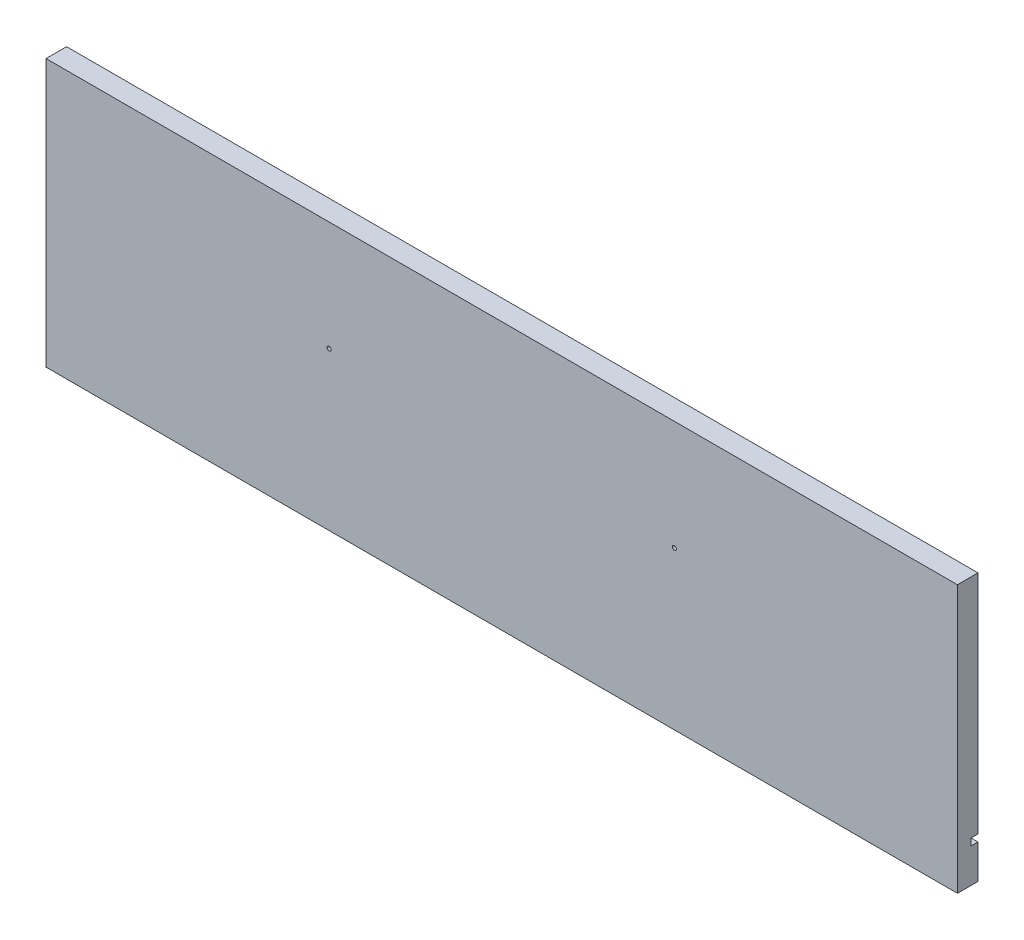
ISO-10303-21;
HEADER;
FILE_DESCRIPTION(('STEP AP214'),'2;1');
FILE_NAME('part.step','',(''),(''),'','','');
FILE_SCHEMA(('AUTOMOTIVE_DESIGN { 1 0 10303 214 1 1 1 1 }'));
ENDSEC;
DATA;
#1=APPLICATION_CONTEXT('core data for automotive mechanical design processes');
#2=APPLICATION_PROTOCOL_DEFINITION('international standard','automotive_design',2000,#1);
#3=PRODUCT_CONTEXT('',#1,'mechanical');
#4=PRODUCT('Part','Part','',(#3));
#5=PRODUCT_RELATED_PRODUCT_CATEGORY('part','',(#4));
#6=PRODUCT_DEFINITION_FORMATION('','',#4);
#7=PRODUCT_DEFINITION_CONTEXT('part definition',#1,'design');
#8=PRODUCT_DEFINITION('design','',#6,#7);
#9=PRODUCT_DEFINITION_SHAPE('','',#8);
#10=(LENGTH_UNIT() NAMED_UNIT(*) SI_UNIT(.MILLI.,.METRE.));
#11=(NAMED_UNIT(*) PLANE_ANGLE_UNIT() SI_UNIT($,.RADIAN.));
#12=(NAMED_UNIT(*) SI_UNIT($,.STERADIAN.) SOLID_ANGLE_UNIT());
#13=UNCERTAINTY_MEASURE_WITH_UNIT(LENGTH_MEASURE(1.E-05),#10,'distance_accuracy_value','');
#14=(GEOMETRIC_REPRESENTATION_CONTEXT(3) GLOBAL_UNCERTAINTY_ASSIGNED_CONTEXT((#13)) GLOBAL_UNIT_ASSIGNED_CONTEXT((#10,
#11,#12)) REPRESENTATION_CONTEXT('',''));
#15=CARTESIAN_POINT('',(0.,0.,0.));
#16=DIRECTION('',(0.,0.,1.));
#17=DIRECTION('',(1.,0.,0.));
#18=AXIS2_PLACEMENT_3D('',#15,#16,#17);
#19=CARTESIAN_POINT('',(-332.5,195.,-15.));
#20=DIRECTION('',(0.,0.,-1.));
#21=DIRECTION('',(-1.,0.,0.));
#22=AXIS2_PLACEMENT_3D('',#19,#20,#21);
#23=PLANE('',#22);
#24=DIRECTION('',(1.,0.,0.));
#25=VECTOR('',#24,1.);
#26=CARTESIAN_POINT('',(-332.5,25.0000000000002,-15.));
#27=LINE('',#26,#25);
#28=CARTESIAN_POINT('',(-332.5,25.0000000000002,-15.));
#29=VERTEX_POINT('',#28);
#30=CARTESIAN_POINT('',(332.5,25.0000000000002,-15.));
#31=VERTEX_POINT('',#30);
#32=EDGE_CURVE('E174',#29,#31,#27,.T.);
#33=ORIENTED_EDGE('',*,*,#32,.T.);
#34=DIRECTION('',(0.,1.,0.));
#35=VECTOR('',#34,1.);
#36=CARTESIAN_POINT('',(332.5,1.22154483793782E-13,-15.));
#37=LINE('',#36,#35);
#38=CARTESIAN_POINT('',(332.5,1.22154483793782E-13,-15.));
#39=VERTEX_POINT('',#38);
#40=EDGE_CURVE('E189',#39,#31,#37,.T.);
#41=ORIENTED_EDGE('',*,*,#40,.F.);
#42=DIRECTION('',(1.,0.,0.));
#43=VECTOR('',#42,1.);
#44=CARTESIAN_POINT('',(-332.5,0.,-15.));
#45=LINE('',#44,#43);
#46=CARTESIAN_POINT('',(-332.5,0.,-15.));
#47=VERTEX_POINT('',#46);
#48=EDGE_CURVE('E185',#47,#39,#45,.T.);
#49=ORIENTED_EDGE('',*,*,#48,.F.);
#50=DIRECTION('',(0.,-1.,0.));
#51=VECTOR('',#50,1.);
#52=CARTESIAN_POINT('',(-332.5,0.,-15.));
#53=LINE('',#52,#51);
#54=EDGE_CURVE('E81',#29,#47,#53,.T.);
#55=ORIENTED_EDGE('',*,*,#54,.F.);
#56=EDGE_LOOP('',(#33,#41,#49,#55));
#57=FACE_BOUND('',#56,.T.);
#58=ADVANCED_FACE('F32',(#57),#23,.T.);
#59=CARTESIAN_POINT('',(-332.5,0.,-15.));
#60=DIRECTION('',(-1.,0.,0.));
#61=DIRECTION('',(0.,0.,1.));
#62=AXIS2_PLACEMENT_3D('',#59,#60,#61);
#63=PLANE('',#62);
#64=DIRECTION('',(0.,0.,-1.));
#65=VECTOR('',#64,1.);
#66=CARTESIAN_POINT('',(-332.5,25.0000000000002,-15.));
#67=LINE('',#66,#65);
#68=CARTESIAN_POINT('',(-332.5,25.0000000000002,-10.));
#69=VERTEX_POINT('',#68);
#70=EDGE_CURVE('E165',#69,#29,#67,.T.);
#71=ORIENTED_EDGE('',*,*,#70,.T.);
#72=ORIENTED_EDGE('',*,*,#54,.T.);
#73=DIRECTION('',(0.,0.,1.));
#74=VECTOR('',#73,1.);
#75=CARTESIAN_POINT('',(-332.5,0.,-15.));
#76=LINE('',#75,#74);
#77=CARTESIAN_POINT('',(-332.5,0.,0.));
#78=VERTEX_POINT('',#77);
#79=EDGE_CURVE('E36',#47,#78,#76,.T.);
#80=ORIENTED_EDGE('',*,*,#79,.T.);
#81=DIRECTION('',(0.,-1.,0.));
#82=VECTOR('',#81,1.);
#83=CARTESIAN_POINT('',(-332.5,0.,0.));
#84=LINE('',#83,#82);
#85=CARTESIAN_POINT('',(-332.5,195.,0.));
#86=VERTEX_POINT('',#85);
#87=EDGE_CURVE('E177',#86,#78,#84,.T.);
#88=ORIENTED_EDGE('',*,*,#87,.F.);
#89=DIRECTION('',(0.,0.,1.));
#90=VECTOR('',#89,1.);
#91=CARTESIAN_POINT('',(-332.5,195.,-15.));
#92=LINE('',#91,#90);
#93=CARTESIAN_POINT('',(-332.5,195.,-15.));
#94=VERTEX_POINT('',#93);
#95=EDGE_CURVE('E11',#94,#86,#92,.T.);
#96=ORIENTED_EDGE('',*,*,#95,.F.);
#97=CARTESIAN_POINT('',(-332.5,30.0000000000002,-15.));
#98=VERTEX_POINT('',#97);
#99=EDGE_CURVE('E183',#94,#98,#53,.T.);
#100=ORIENTED_EDGE('',*,*,#99,.T.);
#101=DIRECTION('',(0.,0.,1.));
#102=VECTOR('',#101,1.);
#103=CARTESIAN_POINT('',(-332.5,30.0000000000002,-15.));
#104=LINE('',#103,#102);
#105=CARTESIAN_POINT('',(-332.5,30.0000000000002,-10.));
#106=VERTEX_POINT('',#105);
#107=EDGE_CURVE('E49',#98,#106,#104,.T.);
#108=ORIENTED_EDGE('',*,*,#107,.T.);
#109=DIRECTION('',(0.,-1.,0.));
#110=VECTOR('',#109,1.);
#111=CARTESIAN_POINT('',(-332.5,25.0000000000002,-10.));
#112=LINE('',#111,#110);
#113=EDGE_CURVE('E161',#106,#69,#112,.T.);
#114=ORIENTED_EDGE('',*,*,#113,.T.);
#115=EDGE_LOOP('',(#71,#72,#80,#88,#96,#100,#108,#114));
#116=FACE_BOUND('',#115,.T.);
#117=ADVANCED_FACE('F34',(#116),#63,.T.);
#118=CARTESIAN_POINT('',(-332.5,195.,-15.));
#119=DIRECTION('',(0.,1.,0.));
#120=DIRECTION('',(-1.,0.,0.));
#121=AXIS2_PLACEMENT_3D('',#118,#119,#120);
#122=PLANE('',#121);
#123=DIRECTION('',(-1.,0.,0.));
#124=VECTOR('',#123,1.);
#125=CARTESIAN_POINT('',(-332.5,195.,0.));
#126=LINE('',#125,#124);
#127=CARTESIAN_POINT('',(332.5,195.,0.));
#128=VERTEX_POINT('',#127);
#129=EDGE_CURVE('E202',#128,#86,#126,.T.);
#130=ORIENTED_EDGE('',*,*,#129,.F.);
#131=DIRECTION('',(0.,0.,1.));
#132=VECTOR('',#131,1.);
#133=CARTESIAN_POINT('',(332.5,195.,-15.));
#134=LINE('',#133,#132);
#135=CARTESIAN_POINT('',(332.5,195.,-15.));
#136=VERTEX_POINT('',#135);
#137=EDGE_CURVE('E41',#136,#128,#134,.T.);
#138=ORIENTED_EDGE('',*,*,#137,.F.);
#139=DIRECTION('',(-1.,0.,0.));
#140=VECTOR('',#139,1.);
#141=CARTESIAN_POINT('',(-332.5,195.,-15.));
#142=LINE('',#141,#140);
#143=EDGE_CURVE('E192',#136,#94,#142,.T.);
#144=ORIENTED_EDGE('',*,*,#143,.T.);
#145=ORIENTED_EDGE('',*,*,#95,.T.);
#146=EDGE_LOOP('',(#130,#138,#144,#145));
#147=FACE_BOUND('',#146,.T.);
#148=ADVANCED_FACE('F214',(#147),#122,.T.);
#149=CARTESIAN_POINT('',(332.5,1.22154483793782E-13,-15.));
#150=DIRECTION('',(1.,0.,0.));
#151=DIRECTION('',(0.,1.,0.));
#152=AXIS2_PLACEMENT_3D('',#149,#150,#151);
#153=PLANE('',#152);
#154=DIRECTION('',(0.,0.,-1.));
#155=VECTOR('',#154,1.);
#156=CARTESIAN_POINT('',(332.5,25.0000000000002,-15.));
#157=LINE('',#156,#155);
#158=CARTESIAN_POINT('',(332.5,25.0000000000002,-10.));
#159=VERTEX_POINT('',#158);
#160=EDGE_CURVE('E162',#159,#31,#157,.T.);
#161=ORIENTED_EDGE('',*,*,#160,.F.);
#162=DIRECTION('',(0.,-1.,0.));
#163=VECTOR('',#162,1.);
#164=CARTESIAN_POINT('',(332.5,25.0000000000002,-10.));
#165=LINE('',#164,#163);
#166=CARTESIAN_POINT('',(332.5,30.0000000000002,-10.));
#167=VERTEX_POINT('',#166);
#168=EDGE_CURVE('E170',#167,#159,#165,.T.);
#169=ORIENTED_EDGE('',*,*,#168,.F.);
#170=DIRECTION('',(0.,0.,1.));
#171=VECTOR('',#170,1.);
#172=CARTESIAN_POINT('',(332.5,30.0000000000002,-15.));
#173=LINE('',#172,#171);
#174=CARTESIAN_POINT('',(332.5,30.0000000000002,-15.));
#175=VERTEX_POINT('',#174);
#176=EDGE_CURVE('E159',#175,#167,#173,.T.);
#177=ORIENTED_EDGE('',*,*,#176,.F.);
#178=EDGE_CURVE('E188',#175,#136,#37,.T.);
#179=ORIENTED_EDGE('',*,*,#178,.T.);
#180=ORIENTED_EDGE('',*,*,#137,.T.);
#181=DIRECTION('',(0.,1.,0.));
#182=VECTOR('',#181,1.);
#183=CARTESIAN_POINT('',(332.5,1.22154483793782E-13,0.));
#184=LINE('',#183,#182);
#185=CARTESIAN_POINT('',(332.5,1.22154483793782E-13,0.));
#186=VERTEX_POINT('',#185);
#187=EDGE_CURVE('E199',#186,#128,#184,.T.);
#188=ORIENTED_EDGE('',*,*,#187,.F.);
#189=DIRECTION('',(0.,0.,1.));
#190=VECTOR('',#189,1.);
#191=CARTESIAN_POINT('',(332.5,1.22154483793782E-13,-15.));
#192=LINE('',#191,#190);
#193=EDGE_CURVE('E205',#39,#186,#192,.T.);
#194=ORIENTED_EDGE('',*,*,#193,.F.);
#195=ORIENTED_EDGE('',*,*,#40,.T.);
#196=EDGE_LOOP('',(#161,#169,#177,#179,#180,#188,#194,#195));
#197=FACE_BOUND('',#196,.T.);
#198=ADVANCED_FACE('F230',(#197),#153,.T.);
#199=CARTESIAN_POINT('',(-332.5,0.,-15.));
#200=DIRECTION('',(0.,-1.,0.));
#201=DIRECTION('',(1.,0.,0.));
#202=AXIS2_PLACEMENT_3D('',#199,#200,#201);
#203=PLANE('',#202);
#204=DIRECTION('',(1.,0.,0.));
#205=VECTOR('',#204,1.);
#206=CARTESIAN_POINT('',(-332.5,0.,0.));
#207=LINE('',#206,#205);
#208=EDGE_CURVE('E196',#78,#186,#207,.T.);
#209=ORIENTED_EDGE('',*,*,#208,.F.);
#210=ORIENTED_EDGE('',*,*,#79,.F.);
#211=ORIENTED_EDGE('',*,*,#48,.T.);
#212=ORIENTED_EDGE('',*,*,#193,.T.);
#213=EDGE_LOOP('',(#209,#210,#211,#212));
#214=FACE_BOUND('',#213,.T.);
#215=ADVANCED_FACE('F210',(#214),#203,.T.);
#216=CARTESIAN_POINT('',(325.,135.,-15.));
#217=DIRECTION('',(0.,0.,-1.));
#218=DIRECTION('',(-1.,0.,0.));
#219=AXIS2_PLACEMENT_3D('',#216,#217,#218);
#220=CIRCLE('',#219,1.5);
#221=CARTESIAN_POINT('',(323.5,135.,-15.));
#222=VERTEX_POINT('',#221);
#223=EDGE_CURVE('E124',#222,#222,#220,.T.);
#224=ORIENTED_EDGE('',*,*,#223,.F.);
#225=EDGE_LOOP('',(#224));
#226=FACE_BOUND('',#225,.T.);
#227=CARTESIAN_POINT('',(325.,45.0000000000002,-15.));
#228=DIRECTION('',(0.,0.,-1.));
#229=DIRECTION('',(-1.,0.,0.));
#230=AXIS2_PLACEMENT_3D('',#227,#228,#229);
#231=CIRCLE('',#230,1.5);
#232=CARTESIAN_POINT('',(323.5,45.0000000000002,-15.));
#233=VERTEX_POINT('',#232);
#234=EDGE_CURVE('E132',#233,#233,#231,.T.);
#235=ORIENTED_EDGE('',*,*,#234,.F.);
#236=EDGE_LOOP('',(#235));
#237=FACE_BOUND('',#236,.T.);
#238=CARTESIAN_POINT('',(-325.,135.000000000001,-15.));
#239=DIRECTION('',(0.,0.,-1.));
#240=DIRECTION('',(-1.,0.,0.));
#241=AXIS2_PLACEMENT_3D('',#238,#239,#240);
#242=CIRCLE('',#241,1.5);
#243=CARTESIAN_POINT('',(-326.5,135.000000000001,-15.));
#244=VERTEX_POINT('',#243);
#245=EDGE_CURVE('E138',#244,#244,#242,.T.);
#246=ORIENTED_EDGE('',*,*,#245,.F.);
#247=EDGE_LOOP('',(#246));
#248=FACE_BOUND('',#247,.T.);
#249=CARTESIAN_POINT('',(-325.,45.0000000000013,-15.));
#250=DIRECTION('',(0.,0.,-1.));
#251=DIRECTION('',(-1.,0.,0.));
#252=AXIS2_PLACEMENT_3D('',#249,#250,#251);
#253=CIRCLE('',#252,1.5);
#254=CARTESIAN_POINT('',(-326.5,45.0000000000013,-15.));
#255=VERTEX_POINT('',#254);
#256=EDGE_CURVE('E144',#255,#255,#253,.T.);
#257=ORIENTED_EDGE('',*,*,#256,.F.);
#258=EDGE_LOOP('',(#257));
#259=FACE_BOUND('',#258,.T.);
#260=CARTESIAN_POINT('',(-126.,115.,-15.));
#261=DIRECTION('',(0.,0.,1.));
#262=DIRECTION('',(1.,0.,0.));
#263=AXIS2_PLACEMENT_3D('',#260,#261,#262);
#264=CIRCLE('',#263,1.5);
#265=CARTESIAN_POINT('',(-124.5,115.,-15.));
#266=VERTEX_POINT('',#265);
#267=EDGE_CURVE('E147',#266,#266,#264,.T.);
#268=ORIENTED_EDGE('',*,*,#267,.T.);
#269=EDGE_LOOP('',(#268));
#270=FACE_BOUND('',#269,.T.);
#271=CARTESIAN_POINT('',(126.,115.,-15.));
#272=DIRECTION('',(0.,0.,1.));
#273=DIRECTION('',(1.,0.,0.));
#274=AXIS2_PLACEMENT_3D('',#271,#272,#273);
#275=CIRCLE('',#274,1.5);
#276=CARTESIAN_POINT('',(127.5,115.,-15.));
#277=VERTEX_POINT('',#276);
#278=EDGE_CURVE('E153',#277,#277,#275,.T.);
#279=ORIENTED_EDGE('',*,*,#278,.T.);
#280=EDGE_LOOP('',(#279));
#281=FACE_BOUND('',#280,.T.);
#282=DIRECTION('',(1.,0.,0.));
#283=VECTOR('',#282,1.);
#284=CARTESIAN_POINT('',(-332.5,30.0000000000002,-15.));
#285=LINE('',#284,#283);
#286=EDGE_CURVE('E167',#98,#175,#285,.T.);
#287=ORIENTED_EDGE('',*,*,#286,.F.);
#288=ORIENTED_EDGE('',*,*,#99,.F.);
#289=ORIENTED_EDGE('',*,*,#143,.F.);
#290=ORIENTED_EDGE('',*,*,#178,.F.);
#291=EDGE_LOOP('',(#287,#288,#289,#290));
#292=FACE_BOUND('',#291,.T.);
#293=ADVANCED_FACE('F219',(#226,#237,#248,#259,#270,#281,#292),#23,.T.);
#294=CARTESIAN_POINT('',(-332.5,195.,0.));
#295=DIRECTION('',(0.,0.,-1.));
#296=DIRECTION('',(-1.,0.,0.));
#297=AXIS2_PLACEMENT_3D('',#294,#295,#296);
#298=PLANE('',#297);
#299=CARTESIAN_POINT('',(-126.,115.,0.));
#300=DIRECTION('',(0.,0.,1.));
#301=DIRECTION('',(1.,0.,0.));
#302=AXIS2_PLACEMENT_3D('',#299,#300,#301);
#303=CIRCLE('',#302,1.5);
#304=CARTESIAN_POINT('',(-124.5,115.,0.));
#305=VERTEX_POINT('',#304);
#306=EDGE_CURVE('E150',#305,#305,#303,.T.);
#307=ORIENTED_EDGE('',*,*,#306,.F.);
#308=EDGE_LOOP('',(#307));
#309=FACE_BOUND('',#308,.T.);
#310=CARTESIAN_POINT('',(126.,115.,0.));
#311=DIRECTION('',(0.,0.,1.));
#312=DIRECTION('',(1.,0.,0.));
#313=AXIS2_PLACEMENT_3D('',#310,#311,#312);
#314=CIRCLE('',#313,1.5);
#315=CARTESIAN_POINT('',(127.5,115.,0.));
#316=VERTEX_POINT('',#315);
#317=EDGE_CURVE('E156',#316,#316,#314,.T.);
#318=ORIENTED_EDGE('',*,*,#317,.F.);
#319=EDGE_LOOP('',(#318));
#320=FACE_BOUND('',#319,.T.);
#321=ORIENTED_EDGE('',*,*,#87,.T.);
#322=ORIENTED_EDGE('',*,*,#208,.T.);
#323=ORIENTED_EDGE('',*,*,#187,.T.);
#324=ORIENTED_EDGE('',*,*,#129,.T.);
#325=EDGE_LOOP('',(#321,#322,#323,#324));
#326=FACE_BOUND('',#325,.T.);
#327=ADVANCED_FACE('F212',(#309,#320,#326),#298,.F.);
#328=CARTESIAN_POINT('',(-332.5,25.0000000000002,-15.));
#329=DIRECTION('',(0.,-1.,0.));
#330=DIRECTION('',(0.,0.,-1.));
#331=AXIS2_PLACEMENT_3D('',#328,#329,#330);
#332=PLANE('',#331);
#333=ORIENTED_EDGE('',*,*,#160,.T.);
#334=ORIENTED_EDGE('',*,*,#32,.F.);
#335=ORIENTED_EDGE('',*,*,#70,.F.);
#336=DIRECTION('',(1.,0.,0.));
#337=VECTOR('',#336,1.);
#338=CARTESIAN_POINT('',(-332.5,25.0000000000002,-10.));
#339=LINE('',#338,#337);
#340=EDGE_CURVE('E178',#69,#159,#339,.T.);
#341=ORIENTED_EDGE('',*,*,#340,.T.);
#342=EDGE_LOOP('',(#333,#334,#335,#341));
#343=FACE_BOUND('',#342,.T.);
#344=ADVANCED_FACE('F227',(#343),#332,.F.);
#345=CARTESIAN_POINT('',(-332.5,25.0000000000002,-10.));
#346=DIRECTION('',(0.,0.,1.));
#347=DIRECTION('',(1.,0.,0.));
#348=AXIS2_PLACEMENT_3D('',#345,#346,#347);
#349=PLANE('',#348);
#350=ORIENTED_EDGE('',*,*,#168,.T.);
#351=ORIENTED_EDGE('',*,*,#340,.F.);
#352=ORIENTED_EDGE('',*,*,#113,.F.);
#353=DIRECTION('',(1.,0.,0.));
#354=VECTOR('',#353,1.);
#355=CARTESIAN_POINT('',(-332.5,30.0000000000002,-10.));
#356=LINE('',#355,#354);
#357=EDGE_CURVE('E180',#106,#167,#356,.T.);
#358=ORIENTED_EDGE('',*,*,#357,.T.);
#359=EDGE_LOOP('',(#350,#351,#352,#358));
#360=FACE_BOUND('',#359,.T.);
#361=ADVANCED_FACE('F223',(#360),#349,.F.);
#362=CARTESIAN_POINT('',(-332.5,30.0000000000002,-15.));
#363=DIRECTION('',(0.,1.,0.));
#364=DIRECTION('',(0.,0.,1.));
#365=AXIS2_PLACEMENT_3D('',#362,#363,#364);
#366=PLANE('',#365);
#367=ORIENTED_EDGE('',*,*,#176,.T.);
#368=ORIENTED_EDGE('',*,*,#357,.F.);
#369=ORIENTED_EDGE('',*,*,#107,.F.);
#370=ORIENTED_EDGE('',*,*,#286,.T.);
#371=EDGE_LOOP('',(#367,#368,#369,#370));
#372=FACE_BOUND('',#371,.T.);
#373=ADVANCED_FACE('F232',(#372),#366,.F.);
#374=CARTESIAN_POINT('',(126.,115.,0.));
#375=DIRECTION('',(0.,0.,1.));
#376=DIRECTION('',(1.,0.,0.));
#377=AXIS2_PLACEMENT_3D('',#374,#375,#376);
#378=CYLINDRICAL_SURFACE('',#377,1.5);
#379=ORIENTED_EDGE('',*,*,#278,.F.);
#380=EDGE_LOOP('',(#379));
#381=FACE_BOUND('',#380,.T.);
#382=ORIENTED_EDGE('',*,*,#317,.T.);
#383=EDGE_LOOP('',(#382));
#384=FACE_BOUND('',#383,.T.);
#385=ADVANCED_FACE('F234',(#381,#384),#378,.F.);
#386=CARTESIAN_POINT('',(-126.,115.,0.));
#387=DIRECTION('',(0.,0.,1.));
#388=DIRECTION('',(1.,0.,0.));
#389=AXIS2_PLACEMENT_3D('',#386,#387,#388);
#390=CYLINDRICAL_SURFACE('',#389,1.5);
#391=ORIENTED_EDGE('',*,*,#267,.F.);
#392=EDGE_LOOP('',(#391));
#393=FACE_BOUND('',#392,.T.);
#394=ORIENTED_EDGE('',*,*,#306,.T.);
#395=EDGE_LOOP('',(#394));
#396=FACE_BOUND('',#395,.T.);
#397=ADVANCED_FACE('F240',(#393,#396),#390,.F.);
#398=CARTESIAN_POINT('',(-325.,45.0000000000013,-15.));
#399=DIRECTION('',(0.,0.,-1.));
#400=DIRECTION('',(-1.,0.,0.));
#401=AXIS2_PLACEMENT_3D('',#398,#399,#400);
#402=CYLINDRICAL_SURFACE('',#401,1.5);
#403=CARTESIAN_POINT('',(-325.,45.0000000000013,-5.));
#404=DIRECTION('',(0.,0.,-1.));
#405=DIRECTION('',(-1.,0.,0.));
#406=AXIS2_PLACEMENT_3D('',#403,#404,#405);
#407=CIRCLE('',#406,1.5);
#408=CARTESIAN_POINT('',(-326.5,45.0000000000013,-5.));
#409=VERTEX_POINT('',#408);
#410=EDGE_CURVE('E141',#409,#409,#407,.T.);
#411=ORIENTED_EDGE('',*,*,#410,.F.);
#412=EDGE_LOOP('',(#411));
#413=FACE_BOUND('',#412,.T.);
#414=ORIENTED_EDGE('',*,*,#256,.T.);
#415=EDGE_LOOP('',(#414));
#416=FACE_BOUND('',#415,.T.);
#417=ADVANCED_FACE('F274',(#413,#416),#402,.F.);
#418=CARTESIAN_POINT('',(-325.,45.0000000000013,-5.));
#419=DIRECTION('',(0.,0.,-1.));
#420=DIRECTION('',(-1.,0.,0.));
#421=AXIS2_PLACEMENT_3D('',#418,#419,#420);
#422=CONICAL_SURFACE('',#421,1.5,1.02974425867665);
#423=CARTESIAN_POINT('',(-325.,45.0000000000013,-4.09870907145866));
#424=VERTEX_POINT('',#423);
#425=VERTEX_LOOP('',#424);
#426=FACE_BOUND('',#425,.T.);
#427=ORIENTED_EDGE('',*,*,#410,.T.);
#428=EDGE_LOOP('',(#427));
#429=FACE_BOUND('',#428,.T.);
#430=ADVANCED_FACE('F280',(#426,#429),#422,.F.);
#431=CARTESIAN_POINT('',(-325.,135.000000000001,-15.));
#432=DIRECTION('',(0.,0.,-1.));
#433=DIRECTION('',(-1.,0.,0.));
#434=AXIS2_PLACEMENT_3D('',#431,#432,#433);
#435=CYLINDRICAL_SURFACE('',#434,1.5);
#436=CARTESIAN_POINT('',(-325.,135.000000000001,-5.));
#437=DIRECTION('',(0.,0.,-1.));
#438=DIRECTION('',(-1.,0.,0.));
#439=AXIS2_PLACEMENT_3D('',#436,#437,#438);
#440=CIRCLE('',#439,1.5);
#441=CARTESIAN_POINT('',(-326.5,135.000000000001,-5.));
#442=VERTEX_POINT('',#441);
#443=EDGE_CURVE('E135',#442,#442,#440,.T.);
#444=ORIENTED_EDGE('',*,*,#443,.F.);
#445=EDGE_LOOP('',(#444));
#446=FACE_BOUND('',#445,.T.);
#447=ORIENTED_EDGE('',*,*,#245,.T.);
#448=EDGE_LOOP('',(#447));
#449=FACE_BOUND('',#448,.T.);
#450=ADVANCED_FACE('F334',(#446,#449),#435,.F.);
#451=CARTESIAN_POINT('',(-325.,135.000000000001,-5.));
#452=DIRECTION('',(0.,0.,-1.));
#453=DIRECTION('',(-1.,0.,0.));
#454=AXIS2_PLACEMENT_3D('',#451,#452,#453);
#455=CONICAL_SURFACE('',#454,1.5,1.02974425867665);
#456=CARTESIAN_POINT('',(-325.,135.000000000001,-4.09870907145866));
#457=VERTEX_POINT('',#456);
#458=VERTEX_LOOP('',#457);
#459=FACE_BOUND('',#458,.T.);
#460=ORIENTED_EDGE('',*,*,#443,.T.);
#461=EDGE_LOOP('',(#460));
#462=FACE_BOUND('',#461,.T.);
#463=ADVANCED_FACE('F343',(#459,#462),#455,.F.);
#464=CARTESIAN_POINT('',(325.,45.0000000000002,-15.));
#465=DIRECTION('',(0.,0.,-1.));
#466=DIRECTION('',(-1.,0.,0.));
#467=AXIS2_PLACEMENT_3D('',#464,#465,#466);
#468=CYLINDRICAL_SURFACE('',#467,1.5);
#469=CARTESIAN_POINT('',(325.,45.0000000000002,-5.));
#470=DIRECTION('',(0.,0.,-1.));
#471=DIRECTION('',(-1.,0.,0.));
#472=AXIS2_PLACEMENT_3D('',#469,#470,#471);
#473=CIRCLE('',#472,1.5);
#474=CARTESIAN_POINT('',(323.5,45.0000000000002,-5.));
#475=VERTEX_POINT('',#474);
#476=EDGE_CURVE('E127',#475,#475,#473,.T.);
#477=ORIENTED_EDGE('',*,*,#476,.F.);
#478=EDGE_LOOP('',(#477));
#479=FACE_BOUND('',#478,.T.);
#480=ORIENTED_EDGE('',*,*,#234,.T.);
#481=EDGE_LOOP('',(#480));
#482=FACE_BOUND('',#481,.T.);
#483=ADVANCED_FACE('F353',(#479,#482),#468,.F.);
#484=CARTESIAN_POINT('',(325.,45.0000000000002,-5.));
#485=DIRECTION('',(0.,0.,-1.));
#486=DIRECTION('',(-1.,0.,0.));
#487=AXIS2_PLACEMENT_3D('',#484,#485,#486);
#488=CONICAL_SURFACE('',#487,1.5,1.02974425867665);
#489=CARTESIAN_POINT('',(325.,45.0000000000002,-4.09870907145866));
#490=VERTEX_POINT('',#489);
#491=VERTEX_LOOP('',#490);
#492=FACE_BOUND('',#491,.T.);
#493=ORIENTED_EDGE('',*,*,#476,.T.);
#494=EDGE_LOOP('',(#493));
#495=FACE_BOUND('',#494,.T.);
#496=ADVANCED_FACE('F363',(#492,#495),#488,.F.);
#497=CARTESIAN_POINT('',(325.,135.,-15.));
#498=DIRECTION('',(0.,0.,-1.));
#499=DIRECTION('',(-1.,0.,0.));
#500=AXIS2_PLACEMENT_3D('',#497,#498,#499);
#501=CYLINDRICAL_SURFACE('',#500,1.5);
#502=CARTESIAN_POINT('',(325.,135.,-5.));
#503=DIRECTION('',(0.,0.,-1.));
#504=DIRECTION('',(-1.,0.,0.));
#505=AXIS2_PLACEMENT_3D('',#502,#503,#504);
#506=CIRCLE('',#505,1.5);
#507=CARTESIAN_POINT('',(323.5,135.,-5.));
#508=VERTEX_POINT('',#507);
#509=EDGE_CURVE('E122',#508,#508,#506,.T.);
#510=ORIENTED_EDGE('',*,*,#509,.F.);
#511=EDGE_LOOP('',(#510));
#512=FACE_BOUND('',#511,.T.);
#513=ORIENTED_EDGE('',*,*,#223,.T.);
#514=EDGE_LOOP('',(#513));
#515=FACE_BOUND('',#514,.T.);
#516=ADVANCED_FACE('F118',(#512,#515),#501,.F.);
#517=CARTESIAN_POINT('',(325.,135.,-5.));
#518=DIRECTION('',(0.,0.,-1.));
#519=DIRECTION('',(-1.,0.,0.));
#520=AXIS2_PLACEMENT_3D('',#517,#518,#519);
#521=CONICAL_SURFACE('',#520,1.5,1.02974425867665);
#522=CARTESIAN_POINT('',(325.,135.,-4.09870907145866));
#523=VERTEX_POINT('',#522);
#524=VERTEX_LOOP('',#523);
#525=FACE_BOUND('',#524,.T.);
#526=ORIENTED_EDGE('',*,*,#509,.T.);
#527=EDGE_LOOP('',(#526));
#528=FACE_BOUND('',#527,.T.);
#529=ADVANCED_FACE('F115',(#525,#528),#521,.F.);
#530=CLOSED_SHELL('',(#58,#117,#148,#198,#215,#293,#327,#344,#361,#373,#385,#397,#417,#430,#450,
#463,#483,#496,#516,#529));
#531=MANIFOLD_SOLID_BREP('B2',#530);
#532=ADVANCED_BREP_SHAPE_REPRESENTATION('',(#18,#531),#14);
#533=SHAPE_DEFINITION_REPRESENTATION(#9,#532);
ENDSEC;
END-ISO-10303-21;
